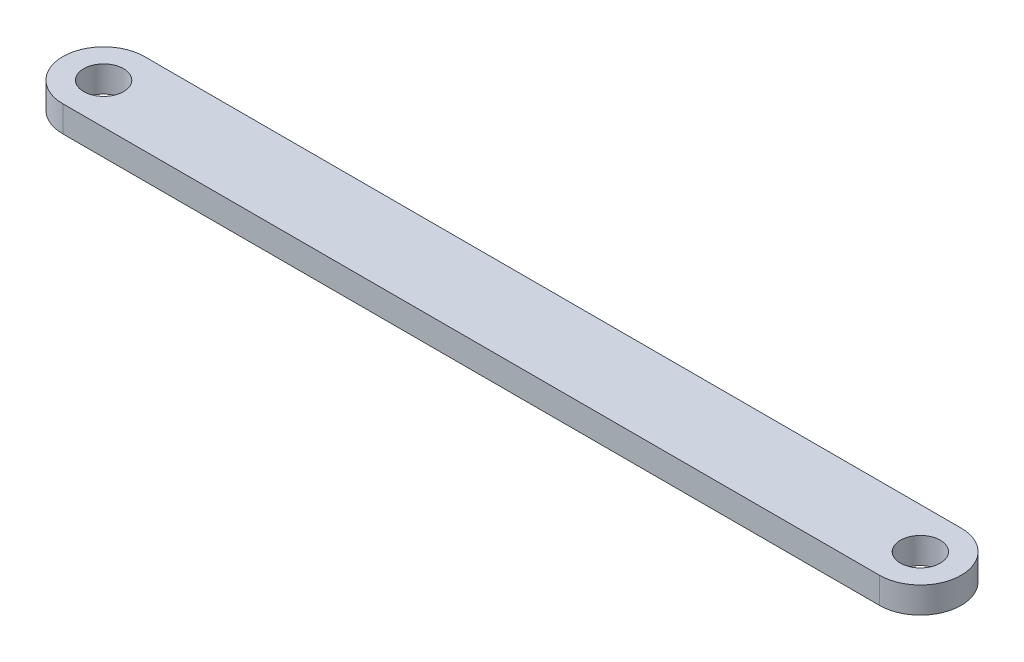
ISO-10303-21;
HEADER;
FILE_DESCRIPTION(('STEP AP214'),'2;1');
FILE_NAME('part.step','',(''),(''),'','','');
FILE_SCHEMA(('AUTOMOTIVE_DESIGN { 1 0 10303 214 1 1 1 1 }'));
ENDSEC;
DATA;
#1=APPLICATION_CONTEXT('core data for automotive mechanical design processes');
#2=APPLICATION_PROTOCOL_DEFINITION('international standard','automotive_design',2000,#1);
#3=PRODUCT_CONTEXT('',#1,'mechanical');
#4=PRODUCT('Part','Part','',(#3));
#5=PRODUCT_RELATED_PRODUCT_CATEGORY('part','',(#4));
#6=PRODUCT_DEFINITION_FORMATION('','',#4);
#7=PRODUCT_DEFINITION_CONTEXT('part definition',#1,'design');
#8=PRODUCT_DEFINITION('design','',#6,#7);
#9=PRODUCT_DEFINITION_SHAPE('','',#8);
#10=(LENGTH_UNIT() NAMED_UNIT(*) SI_UNIT(.MILLI.,.METRE.));
#11=(NAMED_UNIT(*) PLANE_ANGLE_UNIT() SI_UNIT($,.RADIAN.));
#12=(NAMED_UNIT(*) SI_UNIT($,.STERADIAN.) SOLID_ANGLE_UNIT());
#13=UNCERTAINTY_MEASURE_WITH_UNIT(LENGTH_MEASURE(1.E-05),#10,'distance_accuracy_value','');
#14=(GEOMETRIC_REPRESENTATION_CONTEXT(3) GLOBAL_UNCERTAINTY_ASSIGNED_CONTEXT((#13)) GLOBAL_UNIT_ASSIGNED_CONTEXT((#10,
#11,#12)) REPRESENTATION_CONTEXT('',''));
#15=CARTESIAN_POINT('',(0.,0.,0.));
#16=DIRECTION('',(0.,0.,1.));
#17=DIRECTION('',(1.,0.,0.));
#18=AXIS2_PLACEMENT_3D('',#15,#16,#17);
#19=CARTESIAN_POINT('',(0.,8.,0.));
#20=DIRECTION('',(0.,1.,0.));
#21=DIRECTION('',(0.,0.,1.));
#22=AXIS2_PLACEMENT_3D('',#19,#20,#21);
#23=PLANE('',#22);
#24=CARTESIAN_POINT('',(0.,8.,0.));
#25=DIRECTION('',(0.,1.,0.));
#26=DIRECTION('',(0.,0.,1.));
#27=AXIS2_PLACEMENT_3D('',#24,#25,#26);
#28=CIRCLE('',#27,6.1);
#29=CARTESIAN_POINT('',(0.,8.,6.1));
#30=VERTEX_POINT('',#29);
#31=EDGE_CURVE('E112',#30,#30,#28,.T.);
#32=ORIENTED_EDGE('',*,*,#31,.F.);
#33=EDGE_LOOP('',(#32));
#34=FACE_BOUND('',#33,.T.);
#35=CARTESIAN_POINT('',(0.,8.,0.));
#36=DIRECTION('',(0.,1.,0.));
#37=DIRECTION('',(0.,0.,1.));
#38=AXIS2_PLACEMENT_3D('',#35,#36,#37);
#39=CIRCLE('',#38,12.5);
#40=CARTESIAN_POINT('',(0.,8.,-12.5));
#41=VERTEX_POINT('',#40);
#42=CARTESIAN_POINT('',(0.,8.,12.5));
#43=VERTEX_POINT('',#42);
#44=EDGE_CURVE('E92',#41,#43,#39,.T.);
#45=ORIENTED_EDGE('',*,*,#44,.T.);
#46=DIRECTION('',(1.,0.,0.));
#47=VECTOR('',#46,1.);
#48=CARTESIAN_POINT('',(0.,8.,12.5));
#49=LINE('',#48,#47);
#50=CARTESIAN_POINT('',(250.,8.,12.5));
#51=VERTEX_POINT('',#50);
#52=EDGE_CURVE('E87',#43,#51,#49,.T.);
#53=ORIENTED_EDGE('',*,*,#52,.T.);
#54=CARTESIAN_POINT('',(250.,8.,0.));
#55=DIRECTION('',(0.,1.,0.));
#56=DIRECTION('',(0.,0.,1.));
#57=AXIS2_PLACEMENT_3D('',#54,#55,#56);
#58=CIRCLE('',#57,12.5);
#59=CARTESIAN_POINT('',(250.,8.,-12.5));
#60=VERTEX_POINT('',#59);
#61=EDGE_CURVE('E90',#51,#60,#58,.T.);
#62=ORIENTED_EDGE('',*,*,#61,.T.);
#63=DIRECTION('',(-1.,0.,0.));
#64=VECTOR('',#63,1.);
#65=CARTESIAN_POINT('',(0.,8.,-12.5));
#66=LINE('',#65,#64);
#67=EDGE_CURVE('E57',#60,#41,#66,.T.);
#68=ORIENTED_EDGE('',*,*,#67,.T.);
#69=EDGE_LOOP('',(#45,#53,#62,#68));
#70=FACE_BOUND('',#69,.T.);
#71=CARTESIAN_POINT('',(250.,8.,0.));
#72=DIRECTION('',(0.,1.,0.));
#73=DIRECTION('',(0.,0.,1.));
#74=AXIS2_PLACEMENT_3D('',#71,#72,#73);
#75=CIRCLE('',#74,6.09999999999998);
#76=CARTESIAN_POINT('',(250.,8.,6.09999999999998));
#77=VERTEX_POINT('',#76);
#78=EDGE_CURVE('E134',#77,#77,#75,.T.);
#79=ORIENTED_EDGE('',*,*,#78,.F.);
#80=EDGE_LOOP('',(#79));
#81=FACE_BOUND('',#80,.T.);
#82=ADVANCED_FACE('F39',(#34,#70,#81),#23,.T.);
#83=CARTESIAN_POINT('',(0.,0.,0.));
#84=DIRECTION('',(0.,1.,0.));
#85=DIRECTION('',(0.,0.,1.));
#86=AXIS2_PLACEMENT_3D('',#83,#84,#85);
#87=PLANE('',#86);
#88=CARTESIAN_POINT('',(0.,0.,0.));
#89=DIRECTION('',(0.,1.,0.));
#90=DIRECTION('',(0.,0.,1.));
#91=AXIS2_PLACEMENT_3D('',#88,#89,#90);
#92=CIRCLE('',#91,12.5);
#93=CARTESIAN_POINT('',(0.,0.,-12.5));
#94=VERTEX_POINT('',#93);
#95=CARTESIAN_POINT('',(0.,0.,12.5));
#96=VERTEX_POINT('',#95);
#97=EDGE_CURVE('E108',#94,#96,#92,.T.);
#98=ORIENTED_EDGE('',*,*,#97,.F.);
#99=DIRECTION('',(-1.,0.,0.));
#100=VECTOR('',#99,1.);
#101=CARTESIAN_POINT('',(0.,0.,-12.5));
#102=LINE('',#101,#100);
#103=CARTESIAN_POINT('',(250.,0.,-12.5));
#104=VERTEX_POINT('',#103);
#105=EDGE_CURVE('E80',#104,#94,#102,.T.);
#106=ORIENTED_EDGE('',*,*,#105,.F.);
#107=CARTESIAN_POINT('',(250.,0.,0.));
#108=DIRECTION('',(0.,1.,0.));
#109=DIRECTION('',(0.,0.,1.));
#110=AXIS2_PLACEMENT_3D('',#107,#108,#109);
#111=CIRCLE('',#110,12.5);
#112=CARTESIAN_POINT('',(250.,0.,12.5));
#113=VERTEX_POINT('',#112);
#114=EDGE_CURVE('E74',#113,#104,#111,.T.);
#115=ORIENTED_EDGE('',*,*,#114,.F.);
#116=DIRECTION('',(1.,0.,0.));
#117=VECTOR('',#116,1.);
#118=CARTESIAN_POINT('',(0.,0.,12.5));
#119=LINE('',#118,#117);
#120=EDGE_CURVE('E97',#96,#113,#119,.T.);
#121=ORIENTED_EDGE('',*,*,#120,.F.);
#122=EDGE_LOOP('',(#98,#106,#115,#121));
#123=FACE_BOUND('',#122,.T.);
#124=CARTESIAN_POINT('',(0.,0.,0.));
#125=DIRECTION('',(0.,1.,0.));
#126=DIRECTION('',(0.,0.,1.));
#127=AXIS2_PLACEMENT_3D('',#124,#125,#126);
#128=CIRCLE('',#127,6.1);
#129=CARTESIAN_POINT('',(0.,0.,6.1));
#130=VERTEX_POINT('',#129);
#131=EDGE_CURVE('E130',#130,#130,#128,.T.);
#132=ORIENTED_EDGE('',*,*,#131,.T.);
#133=EDGE_LOOP('',(#132));
#134=FACE_BOUND('',#133,.T.);
#135=CARTESIAN_POINT('',(250.,0.,0.));
#136=DIRECTION('',(0.,1.,0.));
#137=DIRECTION('',(0.,0.,1.));
#138=AXIS2_PLACEMENT_3D('',#135,#136,#137);
#139=CIRCLE('',#138,6.09999999999998);
#140=CARTESIAN_POINT('',(250.,0.,6.09999999999998));
#141=VERTEX_POINT('',#140);
#142=EDGE_CURVE('E138',#141,#141,#139,.T.);
#143=ORIENTED_EDGE('',*,*,#142,.T.);
#144=EDGE_LOOP('',(#143));
#145=FACE_BOUND('',#144,.T.);
#146=ADVANCED_FACE('F125',(#123,#134,#145),#87,.F.);
#147=CARTESIAN_POINT('',(0.,8.,0.));
#148=DIRECTION('',(0.,-1.,0.));
#149=DIRECTION('',(0.,0.,-1.));
#150=AXIS2_PLACEMENT_3D('',#147,#148,#149);
#151=CYLINDRICAL_SURFACE('',#150,12.5);
#152=ORIENTED_EDGE('',*,*,#97,.T.);
#153=DIRECTION('',(0.,-1.,0.));
#154=VECTOR('',#153,1.);
#155=CARTESIAN_POINT('',(0.,8.,12.5));
#156=LINE('',#155,#154);
#157=EDGE_CURVE('E11',#43,#96,#156,.T.);
#158=ORIENTED_EDGE('',*,*,#157,.F.);
#159=ORIENTED_EDGE('',*,*,#44,.F.);
#160=DIRECTION('',(0.,-1.,0.));
#161=VECTOR('',#160,1.);
#162=CARTESIAN_POINT('',(0.,8.,-12.5));
#163=LINE('',#162,#161);
#164=EDGE_CURVE('E104',#41,#94,#163,.T.);
#165=ORIENTED_EDGE('',*,*,#164,.T.);
#166=EDGE_LOOP('',(#152,#158,#159,#165));
#167=FACE_BOUND('',#166,.T.);
#168=ADVANCED_FACE('F41',(#167),#151,.T.);
#169=CARTESIAN_POINT('',(0.,8.,12.5));
#170=DIRECTION('',(0.,0.,-1.));
#171=DIRECTION('',(-1.,0.,0.));
#172=AXIS2_PLACEMENT_3D('',#169,#170,#171);
#173=PLANE('',#172);
#174=ORIENTED_EDGE('',*,*,#120,.T.);
#175=DIRECTION('',(0.,-1.,0.));
#176=VECTOR('',#175,1.);
#177=CARTESIAN_POINT('',(250.,8.,12.5));
#178=LINE('',#177,#176);
#179=EDGE_CURVE('E49',#51,#113,#178,.T.);
#180=ORIENTED_EDGE('',*,*,#179,.F.);
#181=ORIENTED_EDGE('',*,*,#52,.F.);
#182=ORIENTED_EDGE('',*,*,#157,.T.);
#183=EDGE_LOOP('',(#174,#180,#181,#182));
#184=FACE_BOUND('',#183,.T.);
#185=ADVANCED_FACE('F96',(#184),#173,.F.);
#186=CARTESIAN_POINT('',(250.,8.,0.));
#187=DIRECTION('',(0.,-1.,0.));
#188=DIRECTION('',(0.,0.,-1.));
#189=AXIS2_PLACEMENT_3D('',#186,#187,#188);
#190=CYLINDRICAL_SURFACE('',#189,12.5);
#191=ORIENTED_EDGE('',*,*,#114,.T.);
#192=DIRECTION('',(0.,-1.,0.));
#193=VECTOR('',#192,1.);
#194=CARTESIAN_POINT('',(250.,8.,-12.5));
#195=LINE('',#194,#193);
#196=EDGE_CURVE('E99',#60,#104,#195,.T.);
#197=ORIENTED_EDGE('',*,*,#196,.F.);
#198=ORIENTED_EDGE('',*,*,#61,.F.);
#199=ORIENTED_EDGE('',*,*,#179,.T.);
#200=EDGE_LOOP('',(#191,#197,#198,#199));
#201=FACE_BOUND('',#200,.T.);
#202=ADVANCED_FACE('F100',(#201),#190,.T.);
#203=CARTESIAN_POINT('',(0.,8.,-12.5));
#204=DIRECTION('',(0.,0.,1.));
#205=DIRECTION('',(1.,0.,0.));
#206=AXIS2_PLACEMENT_3D('',#203,#204,#205);
#207=PLANE('',#206);
#208=ORIENTED_EDGE('',*,*,#105,.T.);
#209=ORIENTED_EDGE('',*,*,#164,.F.);
#210=ORIENTED_EDGE('',*,*,#67,.F.);
#211=ORIENTED_EDGE('',*,*,#196,.T.);
#212=EDGE_LOOP('',(#208,#209,#210,#211));
#213=FACE_BOUND('',#212,.T.);
#214=ADVANCED_FACE('F122',(#213),#207,.F.);
#215=CARTESIAN_POINT('',(0.,8.,0.));
#216=DIRECTION('',(0.,-1.,0.));
#217=DIRECTION('',(0.,0.,-1.));
#218=AXIS2_PLACEMENT_3D('',#215,#216,#217);
#219=CYLINDRICAL_SURFACE('',#218,6.1);
#220=ORIENTED_EDGE('',*,*,#31,.T.);
#221=EDGE_LOOP('',(#220));
#222=FACE_BOUND('',#221,.T.);
#223=ORIENTED_EDGE('',*,*,#131,.F.);
#224=EDGE_LOOP('',(#223));
#225=FACE_BOUND('',#224,.T.);
#226=ADVANCED_FACE('F157',(#222,#225),#219,.F.);
#227=CARTESIAN_POINT('',(250.,8.,0.));
#228=DIRECTION('',(0.,-1.,0.));
#229=DIRECTION('',(0.,0.,-1.));
#230=AXIS2_PLACEMENT_3D('',#227,#228,#229);
#231=CYLINDRICAL_SURFACE('',#230,6.09999999999998);
#232=ORIENTED_EDGE('',*,*,#78,.T.);
#233=EDGE_LOOP('',(#232));
#234=FACE_BOUND('',#233,.T.);
#235=ORIENTED_EDGE('',*,*,#142,.F.);
#236=EDGE_LOOP('',(#235));
#237=FACE_BOUND('',#236,.T.);
#238=ADVANCED_FACE('F146',(#234,#237),#231,.F.);
#239=CLOSED_SHELL('',(#82,#146,#168,#185,#202,#214,#226,#238));
#240=MANIFOLD_SOLID_BREP('B2',#239);
#241=ADVANCED_BREP_SHAPE_REPRESENTATION('',(#18,#240),#14);
#242=SHAPE_DEFINITION_REPRESENTATION(#9,#241);
ENDSEC;
END-ISO-10303-21;
